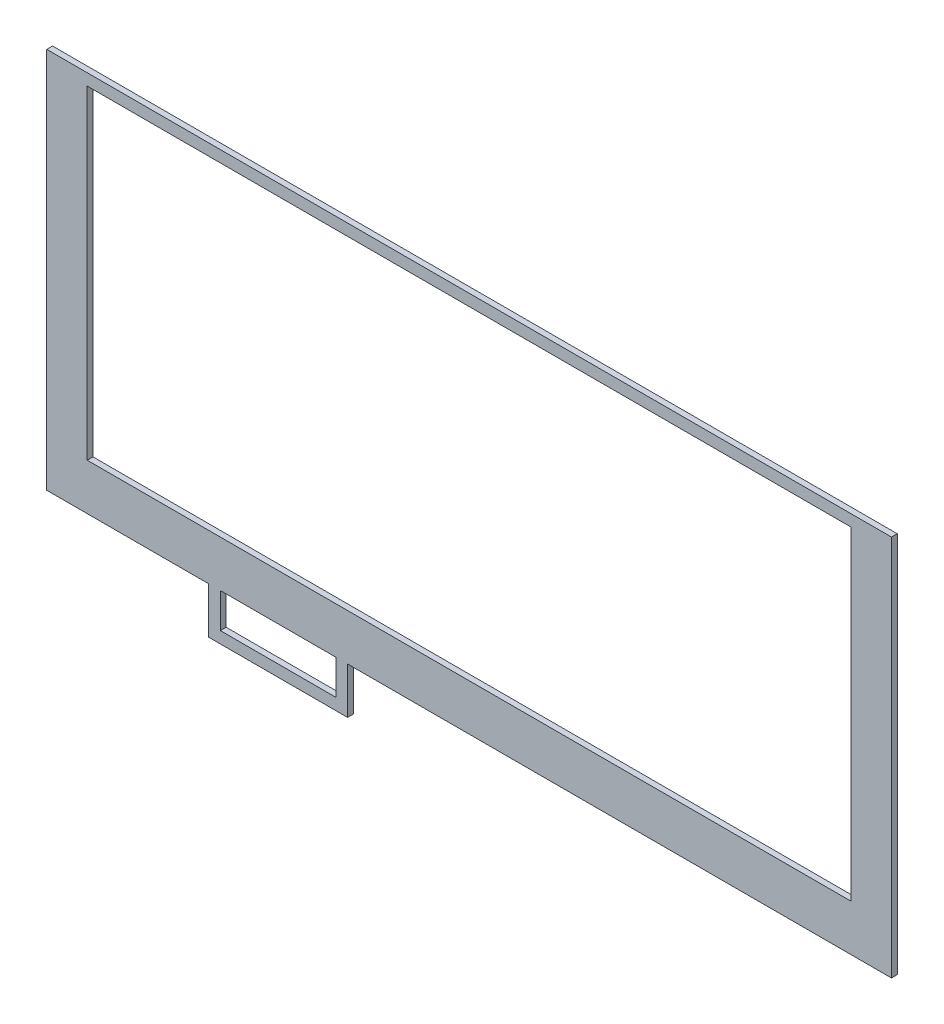
ISO-10303-21;
HEADER;
FILE_DESCRIPTION(('STEP AP214'),'2;1');
FILE_NAME('part.step','',(''),(''),'','','');
FILE_SCHEMA(('AUTOMOTIVE_DESIGN { 1 0 10303 214 1 1 1 1 }'));
ENDSEC;
DATA;
#1=APPLICATION_CONTEXT('core data for automotive mechanical design processes');
#2=APPLICATION_PROTOCOL_DEFINITION('international standard','automotive_design',2000,#1);
#3=PRODUCT_CONTEXT('',#1,'mechanical');
#4=PRODUCT('Part','Part','',(#3));
#5=PRODUCT_RELATED_PRODUCT_CATEGORY('part','',(#4));
#6=PRODUCT_DEFINITION_FORMATION('','',#4);
#7=PRODUCT_DEFINITION_CONTEXT('part definition',#1,'design');
#8=PRODUCT_DEFINITION('design','',#6,#7);
#9=PRODUCT_DEFINITION_SHAPE('','',#8);
#10=(LENGTH_UNIT() NAMED_UNIT(*) SI_UNIT(.MILLI.,.METRE.));
#11=(NAMED_UNIT(*) PLANE_ANGLE_UNIT() SI_UNIT($,.RADIAN.));
#12=(NAMED_UNIT(*) SI_UNIT($,.STERADIAN.) SOLID_ANGLE_UNIT());
#13=UNCERTAINTY_MEASURE_WITH_UNIT(LENGTH_MEASURE(1.E-05),#10,'distance_accuracy_value','');
#14=(GEOMETRIC_REPRESENTATION_CONTEXT(3) GLOBAL_UNCERTAINTY_ASSIGNED_CONTEXT((#13)) GLOBAL_UNIT_ASSIGNED_CONTEXT((#10,
#11,#12)) REPRESENTATION_CONTEXT('',''));
#15=CARTESIAN_POINT('',(0.,0.,0.));
#16=DIRECTION('',(0.,0.,1.));
#17=DIRECTION('',(1.,0.,0.));
#18=AXIS2_PLACEMENT_3D('',#15,#16,#17);
#19=CARTESIAN_POINT('',(-365.,-165.,5.));
#20=DIRECTION('',(0.,1.,0.));
#21=DIRECTION('',(0.,0.,1.));
#22=AXIS2_PLACEMENT_3D('',#19,#20,#21);
#23=PLANE('',#22);
#24=DIRECTION('',(1.,0.,0.));
#25=VECTOR('',#24,1.);
#26=CARTESIAN_POINT('',(-365.,-165.,0.));
#27=LINE('',#26,#25);
#28=CARTESIAN_POINT('',(-215.,-165.,0.));
#29=VERTEX_POINT('',#28);
#30=CARTESIAN_POINT('',(-115.,-165.,0.));
#31=VERTEX_POINT('',#30);
#32=EDGE_CURVE('E256',#29,#31,#27,.T.);
#33=ORIENTED_EDGE('',*,*,#32,.T.);
#34=DIRECTION('',(0.,0.,1.));
#35=VECTOR('',#34,1.);
#36=CARTESIAN_POINT('',(-115.,-165.,-126.491106406735));
#37=LINE('',#36,#35);
#38=CARTESIAN_POINT('',(-115.,-165.,5.));
#39=VERTEX_POINT('',#38);
#40=EDGE_CURVE('E56',#31,#39,#37,.T.);
#41=ORIENTED_EDGE('',*,*,#40,.T.);
#42=DIRECTION('',(1.,0.,0.));
#43=VECTOR('',#42,1.);
#44=CARTESIAN_POINT('',(-365.,-165.,5.));
#45=LINE('',#44,#43);
#46=CARTESIAN_POINT('',(-215.,-165.,5.));
#47=VERTEX_POINT('',#46);
#48=EDGE_CURVE('E247',#47,#39,#45,.T.);
#49=ORIENTED_EDGE('',*,*,#48,.F.);
#50=DIRECTION('',(0.,0.,1.));
#51=VECTOR('',#50,1.);
#52=CARTESIAN_POINT('',(-215.,-165.,-126.491106406735));
#53=LINE('',#52,#51);
#54=EDGE_CURVE('E197',#29,#47,#53,.T.);
#55=ORIENTED_EDGE('',*,*,#54,.F.);
#56=EDGE_LOOP('',(#33,#41,#49,#55));
#57=FACE_BOUND('',#56,.T.);
#58=ADVANCED_FACE('F33',(#57),#23,.F.);
#59=DIRECTION('',(0.,0.,1.));
#60=VECTOR('',#59,1.);
#61=CARTESIAN_POINT('',(-105.,-165.,-126.491106406735));
#62=LINE('',#61,#60);
#63=CARTESIAN_POINT('',(-105.,-165.,0.));
#64=VERTEX_POINT('',#63);
#65=CARTESIAN_POINT('',(-105.,-165.,5.));
#66=VERTEX_POINT('',#65);
#67=EDGE_CURVE('E190',#64,#66,#62,.T.);
#68=ORIENTED_EDGE('',*,*,#67,.F.);
#69=CARTESIAN_POINT('',(365.,-165.,0.));
#70=VERTEX_POINT('',#69);
#71=EDGE_CURVE('E254',#64,#70,#27,.T.);
#72=ORIENTED_EDGE('',*,*,#71,.T.);
#73=DIRECTION('',(0.,0.,-1.));
#74=VECTOR('',#73,1.);
#75=CARTESIAN_POINT('',(365.,-165.,5.));
#76=LINE('',#75,#74);
#77=CARTESIAN_POINT('',(365.,-165.,5.));
#78=VERTEX_POINT('',#77);
#79=EDGE_CURVE('E246',#78,#70,#76,.T.);
#80=ORIENTED_EDGE('',*,*,#79,.F.);
#81=EDGE_CURVE('E48',#66,#78,#45,.T.);
#82=ORIENTED_EDGE('',*,*,#81,.F.);
#83=EDGE_LOOP('',(#68,#72,#80,#82));
#84=FACE_BOUND('',#83,.T.);
#85=ADVANCED_FACE('F299',(#84),#23,.F.);
#86=CARTESIAN_POINT('',(365.,-165.,5.));
#87=DIRECTION('',(-1.,0.,0.));
#88=DIRECTION('',(0.,0.,1.));
#89=AXIS2_PLACEMENT_3D('',#86,#87,#88);
#90=PLANE('',#89);
#91=DIRECTION('',(0.,1.,0.));
#92=VECTOR('',#91,1.);
#93=CARTESIAN_POINT('',(365.,-165.,0.));
#94=LINE('',#93,#92);
#95=CARTESIAN_POINT('',(365.,165.,0.));
#96=VERTEX_POINT('',#95);
#97=EDGE_CURVE('E234',#70,#96,#94,.T.);
#98=ORIENTED_EDGE('',*,*,#97,.T.);
#99=DIRECTION('',(0.,0.,-1.));
#100=VECTOR('',#99,1.);
#101=CARTESIAN_POINT('',(365.,165.,5.));
#102=LINE('',#101,#100);
#103=CARTESIAN_POINT('',(365.,165.,5.));
#104=VERTEX_POINT('',#103);
#105=EDGE_CURVE('E11',#104,#96,#102,.T.);
#106=ORIENTED_EDGE('',*,*,#105,.F.);
#107=DIRECTION('',(0.,1.,0.));
#108=VECTOR('',#107,1.);
#109=CARTESIAN_POINT('',(365.,-165.,5.));
#110=LINE('',#109,#108);
#111=EDGE_CURVE('E235',#78,#104,#110,.T.);
#112=ORIENTED_EDGE('',*,*,#111,.F.);
#113=ORIENTED_EDGE('',*,*,#79,.T.);
#114=EDGE_LOOP('',(#98,#106,#112,#113));
#115=FACE_BOUND('',#114,.T.);
#116=ADVANCED_FACE('F35',(#115),#90,.F.);
#117=CARTESIAN_POINT('',(-365.,165.,5.));
#118=DIRECTION('',(0.,-1.,0.));
#119=DIRECTION('',(0.,0.,-1.));
#120=AXIS2_PLACEMENT_3D('',#117,#118,#119);
#121=PLANE('',#120);
#122=DIRECTION('',(-1.,0.,0.));
#123=VECTOR('',#122,1.);
#124=CARTESIAN_POINT('',(-365.,165.,0.));
#125=LINE('',#124,#123);
#126=CARTESIAN_POINT('',(-365.,165.,0.));
#127=VERTEX_POINT('',#126);
#128=EDGE_CURVE('E250',#96,#127,#125,.T.);
#129=ORIENTED_EDGE('',*,*,#128,.T.);
#130=DIRECTION('',(0.,0.,-1.));
#131=VECTOR('',#130,1.);
#132=CARTESIAN_POINT('',(-365.,165.,5.));
#133=LINE('',#132,#131);
#134=CARTESIAN_POINT('',(-365.,165.,5.));
#135=VERTEX_POINT('',#134);
#136=EDGE_CURVE('E41',#135,#127,#133,.T.);
#137=ORIENTED_EDGE('',*,*,#136,.F.);
#138=DIRECTION('',(-1.,0.,0.));
#139=VECTOR('',#138,1.);
#140=CARTESIAN_POINT('',(-365.,165.,5.));
#141=LINE('',#140,#139);
#142=EDGE_CURVE('E238',#104,#135,#141,.T.);
#143=ORIENTED_EDGE('',*,*,#142,.F.);
#144=ORIENTED_EDGE('',*,*,#105,.T.);
#145=EDGE_LOOP('',(#129,#137,#143,#144));
#146=FACE_BOUND('',#145,.T.);
#147=ADVANCED_FACE('F301',(#146),#121,.F.);
#148=CARTESIAN_POINT('',(-365.,-165.,5.));
#149=DIRECTION('',(1.,0.,0.));
#150=DIRECTION('',(0.,0.,-1.));
#151=AXIS2_PLACEMENT_3D('',#148,#149,#150);
#152=PLANE('',#151);
#153=DIRECTION('',(0.,-1.,0.));
#154=VECTOR('',#153,1.);
#155=CARTESIAN_POINT('',(-365.,-165.,0.));
#156=LINE('',#155,#154);
#157=CARTESIAN_POINT('',(-365.,-165.,0.));
#158=VERTEX_POINT('',#157);
#159=EDGE_CURVE('E252',#127,#158,#156,.T.);
#160=ORIENTED_EDGE('',*,*,#159,.T.);
#161=DIRECTION('',(0.,0.,-1.));
#162=VECTOR('',#161,1.);
#163=CARTESIAN_POINT('',(-365.,-165.,5.));
#164=LINE('',#163,#162);
#165=CARTESIAN_POINT('',(-365.,-165.,5.));
#166=VERTEX_POINT('',#165);
#167=EDGE_CURVE('E259',#166,#158,#164,.T.);
#168=ORIENTED_EDGE('',*,*,#167,.F.);
#169=DIRECTION('',(0.,-1.,0.));
#170=VECTOR('',#169,1.);
#171=CARTESIAN_POINT('',(-365.,-165.,5.));
#172=LINE('',#171,#170);
#173=EDGE_CURVE('E241',#135,#166,#172,.T.);
#174=ORIENTED_EDGE('',*,*,#173,.F.);
#175=ORIENTED_EDGE('',*,*,#136,.T.);
#176=EDGE_LOOP('',(#160,#168,#174,#175));
#177=FACE_BOUND('',#176,.T.);
#178=ADVANCED_FACE('F266',(#177),#152,.F.);
#179=CARTESIAN_POINT('',(-225.,-165.,0.));
#180=VERTEX_POINT('',#179);
#181=EDGE_CURVE('E239',#158,#180,#27,.T.);
#182=ORIENTED_EDGE('',*,*,#181,.T.);
#183=DIRECTION('',(0.,0.,1.));
#184=VECTOR('',#183,1.);
#185=CARTESIAN_POINT('',(-225.,-165.,-126.491106406735));
#186=LINE('',#185,#184);
#187=CARTESIAN_POINT('',(-225.,-165.,5.));
#188=VERTEX_POINT('',#187);
#189=EDGE_CURVE('E188',#180,#188,#186,.T.);
#190=ORIENTED_EDGE('',*,*,#189,.T.);
#191=EDGE_CURVE('E243',#166,#188,#45,.T.);
#192=ORIENTED_EDGE('',*,*,#191,.F.);
#193=ORIENTED_EDGE('',*,*,#167,.T.);
#194=EDGE_LOOP('',(#182,#190,#192,#193));
#195=FACE_BOUND('',#194,.T.);
#196=ADVANCED_FACE('F275',(#195),#23,.F.);
#197=CARTESIAN_POINT('',(0.,0.,5.));
#198=DIRECTION('',(0.,0.,-1.));
#199=DIRECTION('',(-1.,0.,0.));
#200=AXIS2_PLACEMENT_3D('',#197,#198,#199);
#201=PLANE('',#200);
#202=DIRECTION('',(0.,-1.,0.));
#203=VECTOR('',#202,1.);
#204=CARTESIAN_POINT('',(-215.,-1.98914958578674E-13,5.));
#205=LINE('',#204,#203);
#206=CARTESIAN_POINT('',(-215.,-195.,5.));
#207=VERTEX_POINT('',#206);
#208=EDGE_CURVE('E196',#47,#207,#205,.T.);
#209=ORIENTED_EDGE('',*,*,#208,.F.);
#210=ORIENTED_EDGE('',*,*,#48,.T.);
#211=DIRECTION('',(0.,-1.,0.));
#212=VECTOR('',#211,1.);
#213=CARTESIAN_POINT('',(-115.,-1.06396373193244E-13,5.));
#214=LINE('',#213,#212);
#215=CARTESIAN_POINT('',(-115.,-195.,5.));
#216=VERTEX_POINT('',#215);
#217=EDGE_CURVE('E157',#39,#216,#214,.T.);
#218=ORIENTED_EDGE('',*,*,#217,.T.);
#219=DIRECTION('',(1.,0.,0.));
#220=VECTOR('',#219,1.);
#221=CARTESIAN_POINT('',(0.,-195.,5.));
#222=LINE('',#221,#220);
#223=EDGE_CURVE('E163',#207,#216,#222,.T.);
#224=ORIENTED_EDGE('',*,*,#223,.F.);
#225=EDGE_LOOP('',(#209,#210,#218,#224));
#226=FACE_BOUND('',#225,.T.);
#227=DIRECTION('',(0.,-1.,0.));
#228=VECTOR('',#227,1.);
#229=CARTESIAN_POINT('',(-330.,155.,5.));
#230=LINE('',#229,#228);
#231=CARTESIAN_POINT('',(-330.,155.,5.));
#232=VERTEX_POINT('',#231);
#233=CARTESIAN_POINT('',(-330.,-125.,5.));
#234=VERTEX_POINT('',#233);
#235=EDGE_CURVE('E206',#232,#234,#230,.T.);
#236=ORIENTED_EDGE('',*,*,#235,.F.);
#237=DIRECTION('',(-1.,0.,0.));
#238=VECTOR('',#237,1.);
#239=CARTESIAN_POINT('',(330.,155.,5.));
#240=LINE('',#239,#238);
#241=CARTESIAN_POINT('',(330.,155.,5.));
#242=VERTEX_POINT('',#241);
#243=EDGE_CURVE('E209',#242,#232,#240,.T.);
#244=ORIENTED_EDGE('',*,*,#243,.F.);
#245=DIRECTION('',(0.,1.,0.));
#246=VECTOR('',#245,1.);
#247=CARTESIAN_POINT('',(330.,155.,5.));
#248=LINE('',#247,#246);
#249=CARTESIAN_POINT('',(330.,-125.,5.));
#250=VERTEX_POINT('',#249);
#251=EDGE_CURVE('E202',#250,#242,#248,.T.);
#252=ORIENTED_EDGE('',*,*,#251,.F.);
#253=DIRECTION('',(1.,0.,0.));
#254=VECTOR('',#253,1.);
#255=CARTESIAN_POINT('',(330.,-125.,5.));
#256=LINE('',#255,#254);
#257=EDGE_CURVE('E203',#234,#250,#256,.T.);
#258=ORIENTED_EDGE('',*,*,#257,.F.);
#259=EDGE_LOOP('',(#236,#244,#252,#258));
#260=FACE_BOUND('',#259,.T.);
#261=ORIENTED_EDGE('',*,*,#111,.T.);
#262=ORIENTED_EDGE('',*,*,#142,.T.);
#263=ORIENTED_EDGE('',*,*,#173,.T.);
#264=ORIENTED_EDGE('',*,*,#191,.T.);
#265=DIRECTION('',(0.,-1.,0.));
#266=VECTOR('',#265,1.);
#267=CARTESIAN_POINT('',(-225.,-1.56125112837913E-13,5.));
#268=LINE('',#267,#266);
#269=CARTESIAN_POINT('',(-225.,-205.,5.));
#270=VERTEX_POINT('',#269);
#271=EDGE_CURVE('E173',#188,#270,#268,.T.);
#272=ORIENTED_EDGE('',*,*,#271,.T.);
#273=DIRECTION('',(1.,0.,0.));
#274=VECTOR('',#273,1.);
#275=CARTESIAN_POINT('',(0.,-205.,5.));
#276=LINE('',#275,#274);
#277=CARTESIAN_POINT('',(-105.,-205.,5.));
#278=VERTEX_POINT('',#277);
#279=EDGE_CURVE('E170',#270,#278,#276,.T.);
#280=ORIENTED_EDGE('',*,*,#279,.T.);
#281=DIRECTION('',(0.,-1.,0.));
#282=VECTOR('',#281,1.);
#283=CARTESIAN_POINT('',(-105.,0.,5.));
#284=LINE('',#283,#282);
#285=EDGE_CURVE('E192',#66,#278,#284,.T.);
#286=ORIENTED_EDGE('',*,*,#285,.F.);
#287=ORIENTED_EDGE('',*,*,#81,.T.);
#288=EDGE_LOOP('',(#261,#262,#263,#264,#272,#280,#286,#287));
#289=FACE_BOUND('',#288,.T.);
#290=ADVANCED_FACE('F280',(#226,#260,#289),#201,.F.);
#291=CARTESIAN_POINT('',(0.,0.,0.));
#292=DIRECTION('',(0.,0.,-1.));
#293=DIRECTION('',(-1.,0.,0.));
#294=AXIS2_PLACEMENT_3D('',#291,#292,#293);
#295=PLANE('',#294);
#296=ORIENTED_EDGE('',*,*,#32,.F.);
#297=DIRECTION('',(0.,-1.,0.));
#298=VECTOR('',#297,1.);
#299=CARTESIAN_POINT('',(-215.,-1.98914958578674E-13,0.));
#300=LINE('',#299,#298);
#301=CARTESIAN_POINT('',(-215.,-195.,0.));
#302=VERTEX_POINT('',#301);
#303=EDGE_CURVE('E154',#29,#302,#300,.T.);
#304=ORIENTED_EDGE('',*,*,#303,.T.);
#305=DIRECTION('',(1.,0.,0.));
#306=VECTOR('',#305,1.);
#307=CARTESIAN_POINT('',(0.,-195.,0.));
#308=LINE('',#307,#306);
#309=CARTESIAN_POINT('',(-115.,-195.,0.));
#310=VERTEX_POINT('',#309);
#311=EDGE_CURVE('E147',#302,#310,#308,.T.);
#312=ORIENTED_EDGE('',*,*,#311,.T.);
#313=DIRECTION('',(0.,-1.,0.));
#314=VECTOR('',#313,1.);
#315=CARTESIAN_POINT('',(-115.,-1.06396373193244E-13,0.));
#316=LINE('',#315,#314);
#317=EDGE_CURVE('E152',#31,#310,#316,.T.);
#318=ORIENTED_EDGE('',*,*,#317,.F.);
#319=EDGE_LOOP('',(#296,#304,#312,#318));
#320=FACE_BOUND('',#319,.T.);
#321=DIRECTION('',(-1.,0.,0.));
#322=VECTOR('',#321,1.);
#323=CARTESIAN_POINT('',(330.,155.,0.));
#324=LINE('',#323,#322);
#325=CARTESIAN_POINT('',(330.,155.,0.));
#326=VERTEX_POINT('',#325);
#327=CARTESIAN_POINT('',(-330.,155.,0.));
#328=VERTEX_POINT('',#327);
#329=EDGE_CURVE('E205',#326,#328,#324,.T.);
#330=ORIENTED_EDGE('',*,*,#329,.T.);
#331=DIRECTION('',(0.,-1.,0.));
#332=VECTOR('',#331,1.);
#333=CARTESIAN_POINT('',(-330.,155.,0.));
#334=LINE('',#333,#332);
#335=CARTESIAN_POINT('',(-330.,-125.,0.));
#336=VERTEX_POINT('',#335);
#337=EDGE_CURVE('E226',#328,#336,#334,.T.);
#338=ORIENTED_EDGE('',*,*,#337,.T.);
#339=DIRECTION('',(1.,0.,0.));
#340=VECTOR('',#339,1.);
#341=CARTESIAN_POINT('',(330.,-125.,0.));
#342=LINE('',#341,#340);
#343=CARTESIAN_POINT('',(330.,-125.,0.));
#344=VERTEX_POINT('',#343);
#345=EDGE_CURVE('E222',#336,#344,#342,.T.);
#346=ORIENTED_EDGE('',*,*,#345,.T.);
#347=DIRECTION('',(0.,1.,0.));
#348=VECTOR('',#347,1.);
#349=CARTESIAN_POINT('',(330.,155.,0.));
#350=LINE('',#349,#348);
#351=EDGE_CURVE('E217',#344,#326,#350,.T.);
#352=ORIENTED_EDGE('',*,*,#351,.T.);
#353=EDGE_LOOP('',(#330,#338,#346,#352));
#354=FACE_BOUND('',#353,.T.);
#355=ORIENTED_EDGE('',*,*,#97,.F.);
#356=ORIENTED_EDGE('',*,*,#71,.F.);
#357=DIRECTION('',(0.,-1.,0.));
#358=VECTOR('',#357,1.);
#359=CARTESIAN_POINT('',(-105.,0.,0.));
#360=LINE('',#359,#358);
#361=CARTESIAN_POINT('',(-105.,-205.,0.));
#362=VERTEX_POINT('',#361);
#363=EDGE_CURVE('E178',#64,#362,#360,.T.);
#364=ORIENTED_EDGE('',*,*,#363,.T.);
#365=DIRECTION('',(1.,0.,0.));
#366=VECTOR('',#365,1.);
#367=CARTESIAN_POINT('',(0.,-205.,0.));
#368=LINE('',#367,#366);
#369=CARTESIAN_POINT('',(-225.,-205.,0.));
#370=VERTEX_POINT('',#369);
#371=EDGE_CURVE('E180',#370,#362,#368,.T.);
#372=ORIENTED_EDGE('',*,*,#371,.F.);
#373=DIRECTION('',(0.,-1.,0.));
#374=VECTOR('',#373,1.);
#375=CARTESIAN_POINT('',(-225.,-1.56125112837913E-13,0.));
#376=LINE('',#375,#374);
#377=EDGE_CURVE('E185',#180,#370,#376,.T.);
#378=ORIENTED_EDGE('',*,*,#377,.F.);
#379=ORIENTED_EDGE('',*,*,#181,.F.);
#380=ORIENTED_EDGE('',*,*,#159,.F.);
#381=ORIENTED_EDGE('',*,*,#128,.F.);
#382=EDGE_LOOP('',(#355,#356,#364,#372,#378,#379,#380,#381));
#383=FACE_BOUND('',#382,.T.);
#384=ADVANCED_FACE('F149',(#320,#354,#383),#295,.T.);
#385=CARTESIAN_POINT('',(330.,155.,-716.937933157397));
#386=DIRECTION('',(0.,1.,0.));
#387=DIRECTION('',(-1.,0.,0.));
#388=AXIS2_PLACEMENT_3D('',#385,#386,#387);
#389=PLANE('',#388);
#390=DIRECTION('',(0.,0.,1.));
#391=VECTOR('',#390,1.);
#392=CARTESIAN_POINT('',(330.,155.,-716.937933157397));
#393=LINE('',#392,#391);
#394=EDGE_CURVE('E220',#326,#242,#393,.T.);
#395=ORIENTED_EDGE('',*,*,#394,.T.);
#396=ORIENTED_EDGE('',*,*,#243,.T.);
#397=DIRECTION('',(0.,0.,1.));
#398=VECTOR('',#397,1.);
#399=CARTESIAN_POINT('',(-330.,155.,-716.937933157397));
#400=LINE('',#399,#398);
#401=EDGE_CURVE('E216',#328,#232,#400,.T.);
#402=ORIENTED_EDGE('',*,*,#401,.F.);
#403=ORIENTED_EDGE('',*,*,#329,.F.);
#404=EDGE_LOOP('',(#395,#396,#402,#403));
#405=FACE_BOUND('',#404,.T.);
#406=ADVANCED_FACE('F323',(#405),#389,.F.);
#407=CARTESIAN_POINT('',(-330.,155.,-716.937933157397));
#408=DIRECTION('',(-1.,0.,0.));
#409=DIRECTION('',(0.,-1.,0.));
#410=AXIS2_PLACEMENT_3D('',#407,#408,#409);
#411=PLANE('',#410);
#412=ORIENTED_EDGE('',*,*,#401,.T.);
#413=ORIENTED_EDGE('',*,*,#235,.T.);
#414=DIRECTION('',(0.,0.,1.));
#415=VECTOR('',#414,1.);
#416=CARTESIAN_POINT('',(-330.,-125.,-716.937933157397));
#417=LINE('',#416,#415);
#418=EDGE_CURVE('E225',#336,#234,#417,.T.);
#419=ORIENTED_EDGE('',*,*,#418,.F.);
#420=ORIENTED_EDGE('',*,*,#337,.F.);
#421=EDGE_LOOP('',(#412,#413,#419,#420));
#422=FACE_BOUND('',#421,.T.);
#423=ADVANCED_FACE('F327',(#422),#411,.F.);
#424=CARTESIAN_POINT('',(330.,-125.,-716.937933157397));
#425=DIRECTION('',(0.,-1.,0.));
#426=DIRECTION('',(1.,0.,0.));
#427=AXIS2_PLACEMENT_3D('',#424,#425,#426);
#428=PLANE('',#427);
#429=ORIENTED_EDGE('',*,*,#418,.T.);
#430=ORIENTED_EDGE('',*,*,#257,.T.);
#431=DIRECTION('',(0.,0.,1.));
#432=VECTOR('',#431,1.);
#433=CARTESIAN_POINT('',(330.,-125.,-716.937933157397));
#434=LINE('',#433,#432);
#435=EDGE_CURVE('E221',#344,#250,#434,.T.);
#436=ORIENTED_EDGE('',*,*,#435,.F.);
#437=ORIENTED_EDGE('',*,*,#345,.F.);
#438=EDGE_LOOP('',(#429,#430,#436,#437));
#439=FACE_BOUND('',#438,.T.);
#440=ADVANCED_FACE('F331',(#439),#428,.F.);
#441=CARTESIAN_POINT('',(330.,155.,-716.937933157397));
#442=DIRECTION('',(1.,0.,0.));
#443=DIRECTION('',(0.,1.,0.));
#444=AXIS2_PLACEMENT_3D('',#441,#442,#443);
#445=PLANE('',#444);
#446=ORIENTED_EDGE('',*,*,#435,.T.);
#447=ORIENTED_EDGE('',*,*,#251,.T.);
#448=ORIENTED_EDGE('',*,*,#394,.F.);
#449=ORIENTED_EDGE('',*,*,#351,.F.);
#450=EDGE_LOOP('',(#446,#447,#448,#449));
#451=FACE_BOUND('',#450,.T.);
#452=ADVANCED_FACE('F335',(#451),#445,.F.);
#453=CARTESIAN_POINT('',(-115.,-1.06396373193244E-13,-126.491106406735));
#454=DIRECTION('',(-1.,0.,0.));
#455=DIRECTION('',(0.,-1.,0.));
#456=AXIS2_PLACEMENT_3D('',#453,#454,#455);
#457=PLANE('',#456);
#458=ORIENTED_EDGE('',*,*,#40,.F.);
#459=ORIENTED_EDGE('',*,*,#317,.T.);
#460=DIRECTION('',(0.,0.,1.));
#461=VECTOR('',#460,1.);
#462=CARTESIAN_POINT('',(-115.,-195.,-126.491106406735));
#463=LINE('',#462,#461);
#464=EDGE_CURVE('E160',#310,#216,#463,.T.);
#465=ORIENTED_EDGE('',*,*,#464,.T.);
#466=ORIENTED_EDGE('',*,*,#217,.F.);
#467=EDGE_LOOP('',(#458,#459,#465,#466));
#468=FACE_BOUND('',#467,.T.);
#469=ADVANCED_FACE('F169',(#468),#457,.T.);
#470=CARTESIAN_POINT('',(0.,-195.,-126.491106406735));
#471=DIRECTION('',(0.,-1.,0.));
#472=DIRECTION('',(0.,0.,-1.));
#473=AXIS2_PLACEMENT_3D('',#470,#471,#472);
#474=PLANE('',#473);
#475=ORIENTED_EDGE('',*,*,#311,.F.);
#476=DIRECTION('',(0.,0.,1.));
#477=VECTOR('',#476,1.);
#478=CARTESIAN_POINT('',(-215.,-195.,-126.491106406735));
#479=LINE('',#478,#477);
#480=EDGE_CURVE('E167',#302,#207,#479,.T.);
#481=ORIENTED_EDGE('',*,*,#480,.T.);
#482=ORIENTED_EDGE('',*,*,#223,.T.);
#483=ORIENTED_EDGE('',*,*,#464,.F.);
#484=EDGE_LOOP('',(#475,#481,#482,#483));
#485=FACE_BOUND('',#484,.T.);
#486=ADVANCED_FACE('F161',(#485),#474,.F.);
#487=CARTESIAN_POINT('',(-215.,-1.98914958578674E-13,-126.491106406735));
#488=DIRECTION('',(-1.,0.,0.));
#489=DIRECTION('',(0.,-1.,0.));
#490=AXIS2_PLACEMENT_3D('',#487,#488,#489);
#491=PLANE('',#490);
#492=ORIENTED_EDGE('',*,*,#303,.F.);
#493=ORIENTED_EDGE('',*,*,#54,.T.);
#494=ORIENTED_EDGE('',*,*,#208,.T.);
#495=ORIENTED_EDGE('',*,*,#480,.F.);
#496=EDGE_LOOP('',(#492,#493,#494,#495));
#497=FACE_BOUND('',#496,.T.);
#498=ADVANCED_FACE('F291',(#497),#491,.F.);
#499=CARTESIAN_POINT('',(-225.,-1.56125112837913E-13,-126.491106406735));
#500=DIRECTION('',(-1.,0.,0.));
#501=DIRECTION('',(0.,-1.,0.));
#502=AXIS2_PLACEMENT_3D('',#499,#500,#501);
#503=PLANE('',#502);
#504=ORIENTED_EDGE('',*,*,#189,.F.);
#505=ORIENTED_EDGE('',*,*,#377,.T.);
#506=DIRECTION('',(0.,0.,1.));
#507=VECTOR('',#506,1.);
#508=CARTESIAN_POINT('',(-225.,-205.,-126.491106406735));
#509=LINE('',#508,#507);
#510=EDGE_CURVE('E184',#370,#270,#509,.T.);
#511=ORIENTED_EDGE('',*,*,#510,.T.);
#512=ORIENTED_EDGE('',*,*,#271,.F.);
#513=EDGE_LOOP('',(#504,#505,#511,#512));
#514=FACE_BOUND('',#513,.T.);
#515=ADVANCED_FACE('F282',(#514),#503,.T.);
#516=CARTESIAN_POINT('',(0.,-205.,-126.491106406735));
#517=DIRECTION('',(0.,-1.,0.));
#518=DIRECTION('',(0.,0.,-1.));
#519=AXIS2_PLACEMENT_3D('',#516,#517,#518);
#520=PLANE('',#519);
#521=ORIENTED_EDGE('',*,*,#510,.F.);
#522=ORIENTED_EDGE('',*,*,#371,.T.);
#523=DIRECTION('',(0.,0.,1.));
#524=VECTOR('',#523,1.);
#525=CARTESIAN_POINT('',(-105.,-205.,-126.491106406735));
#526=LINE('',#525,#524);
#527=EDGE_CURVE('E183',#362,#278,#526,.T.);
#528=ORIENTED_EDGE('',*,*,#527,.T.);
#529=ORIENTED_EDGE('',*,*,#279,.F.);
#530=EDGE_LOOP('',(#521,#522,#528,#529));
#531=FACE_BOUND('',#530,.T.);
#532=ADVANCED_FACE('F348',(#531),#520,.T.);
#533=CARTESIAN_POINT('',(-105.,0.,-126.491106406735));
#534=DIRECTION('',(-1.,0.,0.));
#535=DIRECTION('',(0.,-1.,0.));
#536=AXIS2_PLACEMENT_3D('',#533,#534,#535);
#537=PLANE('',#536);
#538=ORIENTED_EDGE('',*,*,#363,.F.);
#539=ORIENTED_EDGE('',*,*,#67,.T.);
#540=ORIENTED_EDGE('',*,*,#285,.T.);
#541=ORIENTED_EDGE('',*,*,#527,.F.);
#542=EDGE_LOOP('',(#538,#539,#540,#541));
#543=FACE_BOUND('',#542,.T.);
#544=ADVANCED_FACE('F351',(#543),#537,.F.);
#545=CLOSED_SHELL('',(#58,#85,#116,#147,#178,#196,#290,#384,#406,#423,#440,#452,#469,#486,#498,
#515,#532,#544));
#546=MANIFOLD_SOLID_BREP('B2',#545);
#547=ADVANCED_BREP_SHAPE_REPRESENTATION('',(#18,#546),#14);
#548=SHAPE_DEFINITION_REPRESENTATION(#9,#547);
ENDSEC;
END-ISO-10303-21;
